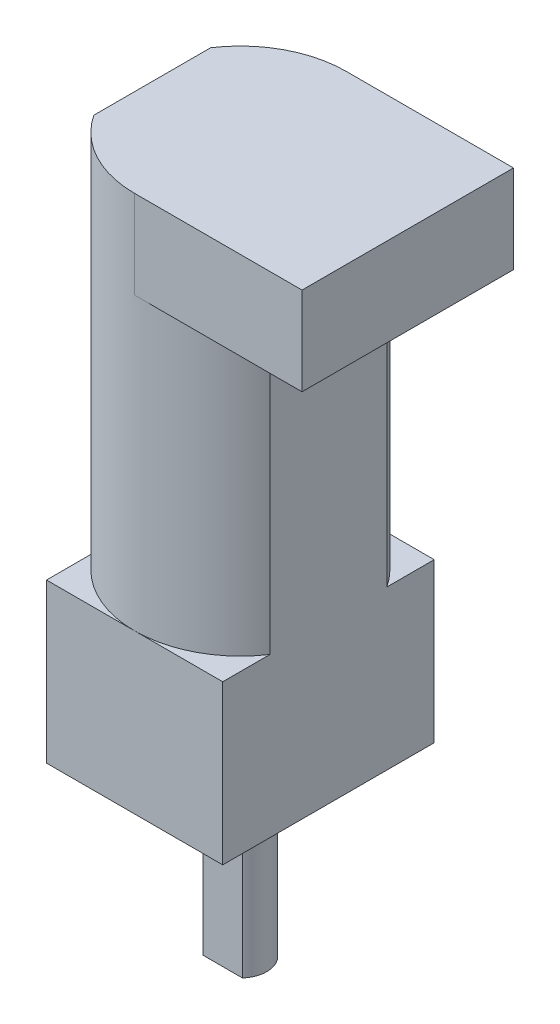
ISO-10303-21;
HEADER;
FILE_DESCRIPTION(('STEP AP214'),'2;1');
FILE_NAME('part.step','',(''),(''),'','','');
FILE_SCHEMA(('AUTOMOTIVE_DESIGN { 1 0 10303 214 1 1 1 1 }'));
ENDSEC;
DATA;
#1=APPLICATION_CONTEXT('core data for automotive mechanical design processes');
#2=APPLICATION_PROTOCOL_DEFINITION('international standard','automotive_design',2000,#1);
#3=PRODUCT_CONTEXT('',#1,'mechanical');
#4=PRODUCT('Part','Part','',(#3));
#5=PRODUCT_RELATED_PRODUCT_CATEGORY('part','',(#4));
#6=PRODUCT_DEFINITION_FORMATION('','',#4);
#7=PRODUCT_DEFINITION_CONTEXT('part definition',#1,'design');
#8=PRODUCT_DEFINITION('design','',#6,#7);
#9=PRODUCT_DEFINITION_SHAPE('','',#8);
#10=(LENGTH_UNIT() NAMED_UNIT(*) SI_UNIT(.MILLI.,.METRE.));
#11=(NAMED_UNIT(*) PLANE_ANGLE_UNIT() SI_UNIT($,.RADIAN.));
#12=(NAMED_UNIT(*) SI_UNIT($,.STERADIAN.) SOLID_ANGLE_UNIT());
#13=UNCERTAINTY_MEASURE_WITH_UNIT(LENGTH_MEASURE(1.E-05),#10,'distance_accuracy_value','');
#14=(GEOMETRIC_REPRESENTATION_CONTEXT(3) GLOBAL_UNCERTAINTY_ASSIGNED_CONTEXT((#13)) GLOBAL_UNIT_ASSIGNED_CONTEXT((#10,
#11,#12)) REPRESENTATION_CONTEXT('',''));
#15=CARTESIAN_POINT('',(0.,0.,0.));
#16=DIRECTION('',(0.,0.,1.));
#17=DIRECTION('',(1.,0.,0.));
#18=AXIS2_PLACEMENT_3D('',#15,#16,#17);
#19=CARTESIAN_POINT('',(0.,21.5,0.));
#20=DIRECTION('',(0.,-1.,0.));
#21=DIRECTION('',(0.,0.,-1.));
#22=AXIS2_PLACEMENT_3D('',#19,#20,#21);
#23=CYLINDRICAL_SURFACE('',#22,6.);
#24=DIRECTION('',(0.,1.,0.));
#25=VECTOR('',#24,1.);
#26=CARTESIAN_POINT('',(0.,16.5,6.));
#27=LINE('',#26,#25);
#28=CARTESIAN_POINT('',(0.,16.5,6.));
#29=VERTEX_POINT('',#28);
#30=CARTESIAN_POINT('',(0.,21.5,6.));
#31=VERTEX_POINT('',#30);
#32=EDGE_CURVE('E219',#29,#31,#27,.T.);
#33=ORIENTED_EDGE('',*,*,#32,.T.);
#34=CARTESIAN_POINT('',(0.,21.5,0.));
#35=DIRECTION('',(0.,1.,0.));
#36=DIRECTION('',(0.,0.,1.));
#37=AXIS2_PLACEMENT_3D('',#34,#35,#36);
#38=CIRCLE('',#37,6.);
#39=CARTESIAN_POINT('',(-5.,21.5,3.3166247903554));
#40=VERTEX_POINT('',#39);
#41=EDGE_CURVE('E238',#40,#31,#38,.T.);
#42=ORIENTED_EDGE('',*,*,#41,.F.);
#43=DIRECTION('',(0.,-1.,0.));
#44=VECTOR('',#43,1.);
#45=CARTESIAN_POINT('',(-5.,21.5,3.3166247903554));
#46=LINE('',#45,#44);
#47=CARTESIAN_POINT('',(-5.,0.,3.3166247903554));
#48=VERTEX_POINT('',#47);
#49=EDGE_CURVE('E246',#40,#48,#46,.T.);
#50=ORIENTED_EDGE('',*,*,#49,.T.);
#51=CARTESIAN_POINT('',(0.,0.,0.));
#52=DIRECTION('',(0.,1.,0.));
#53=DIRECTION('',(0.,0.,1.));
#54=AXIS2_PLACEMENT_3D('',#51,#52,#53);
#55=CIRCLE('',#54,6.);
#56=CARTESIAN_POINT('',(0.,0.,6.));
#57=VERTEX_POINT('',#56);
#58=EDGE_CURVE('E247',#48,#57,#55,.T.);
#59=ORIENTED_EDGE('',*,*,#58,.T.);
#60=CARTESIAN_POINT('',(5.,0.,3.3166247903554));
#61=VERTEX_POINT('',#60);
#62=EDGE_CURVE('E237',#57,#61,#55,.T.);
#63=ORIENTED_EDGE('',*,*,#62,.T.);
#64=DIRECTION('',(0.,-1.,0.));
#65=VECTOR('',#64,1.);
#66=CARTESIAN_POINT('',(5.,21.5,3.3166247903554));
#67=LINE('',#66,#65);
#68=CARTESIAN_POINT('',(5.,16.5,3.3166247903554));
#69=VERTEX_POINT('',#68);
#70=EDGE_CURVE('E260',#69,#61,#67,.T.);
#71=ORIENTED_EDGE('',*,*,#70,.F.);
#72=CARTESIAN_POINT('',(0.,16.5,0.));
#73=DIRECTION('',(0.,1.,0.));
#74=DIRECTION('',(0.,0.,1.));
#75=AXIS2_PLACEMENT_3D('',#72,#73,#74);
#76=CIRCLE('',#75,6.);
#77=EDGE_CURVE('E235',#29,#69,#76,.T.);
#78=ORIENTED_EDGE('',*,*,#77,.F.);
#79=EDGE_LOOP('',(#33,#42,#50,#59,#63,#71,#78));
#80=FACE_BOUND('',#79,.T.);
#81=ADVANCED_FACE('F40',(#80),#23,.T.);
#82=CARTESIAN_POINT('',(5.,21.5,3.3166247903554));
#83=DIRECTION('',(-1.,0.,0.));
#84=DIRECTION('',(0.,0.,1.));
#85=AXIS2_PLACEMENT_3D('',#82,#83,#84);
#86=PLANE('',#85);
#87=DIRECTION('',(0.,0.,-1.));
#88=VECTOR('',#87,1.);
#89=CARTESIAN_POINT('',(5.,16.5,3.3166247903554));
#90=LINE('',#89,#88);
#91=CARTESIAN_POINT('',(5.,16.5,-3.3166247903554));
#92=VERTEX_POINT('',#91);
#93=EDGE_CURVE('E227',#69,#92,#90,.T.);
#94=ORIENTED_EDGE('',*,*,#93,.F.);
#95=ORIENTED_EDGE('',*,*,#70,.T.);
#96=DIRECTION('',(0.,0.,1.));
#97=VECTOR('',#96,1.);
#98=CARTESIAN_POINT('',(5.,0.,-6.));
#99=LINE('',#98,#97);
#100=CARTESIAN_POINT('',(5.,0.,6.));
#101=VERTEX_POINT('',#100);
#102=EDGE_CURVE('E191',#61,#101,#99,.T.);
#103=ORIENTED_EDGE('',*,*,#102,.T.);
#104=DIRECTION('',(0.,1.,0.));
#105=VECTOR('',#104,1.);
#106=CARTESIAN_POINT('',(5.,-9.,6.));
#107=LINE('',#106,#105);
#108=CARTESIAN_POINT('',(5.,-9.,6.));
#109=VERTEX_POINT('',#108);
#110=EDGE_CURVE('E200',#109,#101,#107,.T.);
#111=ORIENTED_EDGE('',*,*,#110,.F.);
#112=DIRECTION('',(0.,0.,1.));
#113=VECTOR('',#112,1.);
#114=CARTESIAN_POINT('',(5.,-9.,-6.));
#115=LINE('',#114,#113);
#116=CARTESIAN_POINT('',(5.,-9.,-6.));
#117=VERTEX_POINT('',#116);
#118=EDGE_CURVE('E179',#117,#109,#115,.T.);
#119=ORIENTED_EDGE('',*,*,#118,.F.);
#120=DIRECTION('',(0.,1.,0.));
#121=VECTOR('',#120,1.);
#122=CARTESIAN_POINT('',(5.,-9.,-6.));
#123=LINE('',#122,#121);
#124=CARTESIAN_POINT('',(5.,0.,-6.));
#125=VERTEX_POINT('',#124);
#126=EDGE_CURVE('E203',#117,#125,#123,.T.);
#127=ORIENTED_EDGE('',*,*,#126,.T.);
#128=CARTESIAN_POINT('',(5.,0.,-3.31662479035541));
#129=VERTEX_POINT('',#128);
#130=EDGE_CURVE('E192',#125,#129,#99,.T.);
#131=ORIENTED_EDGE('',*,*,#130,.T.);
#132=DIRECTION('',(0.,-1.,0.));
#133=VECTOR('',#132,1.);
#134=CARTESIAN_POINT('',(5.,21.5,-3.3166247903554));
#135=LINE('',#134,#133);
#136=EDGE_CURVE('E258',#92,#129,#135,.T.);
#137=ORIENTED_EDGE('',*,*,#136,.F.);
#138=EDGE_LOOP('',(#94,#95,#103,#111,#119,#127,#131,#137));
#139=FACE_BOUND('',#138,.T.);
#140=ADVANCED_FACE('F303',(#139),#86,.F.);
#141=CARTESIAN_POINT('',(0.,21.5,0.));
#142=DIRECTION('',(0.,-1.,0.));
#143=DIRECTION('',(0.,0.,-1.));
#144=AXIS2_PLACEMENT_3D('',#141,#142,#143);
#145=CYLINDRICAL_SURFACE('',#144,6.);
#146=CARTESIAN_POINT('',(0.,21.5,0.));
#147=DIRECTION('',(0.,1.,0.));
#148=DIRECTION('',(0.,0.,1.));
#149=AXIS2_PLACEMENT_3D('',#146,#147,#148);
#150=CIRCLE('',#149,6.);
#151=CARTESIAN_POINT('',(0.,21.5,-6.));
#152=VERTEX_POINT('',#151);
#153=CARTESIAN_POINT('',(-5.,21.5,-3.3166247903554));
#154=VERTEX_POINT('',#153);
#155=EDGE_CURVE('E241',#152,#154,#150,.T.);
#156=ORIENTED_EDGE('',*,*,#155,.F.);
#157=DIRECTION('',(0.,1.,0.));
#158=VECTOR('',#157,1.);
#159=CARTESIAN_POINT('',(0.,16.5,-6.));
#160=LINE('',#159,#158);
#161=CARTESIAN_POINT('',(0.,16.5,-6.));
#162=VERTEX_POINT('',#161);
#163=EDGE_CURVE('E225',#162,#152,#160,.T.);
#164=ORIENTED_EDGE('',*,*,#163,.F.);
#165=CARTESIAN_POINT('',(0.,16.5,0.));
#166=DIRECTION('',(0.,1.,0.));
#167=DIRECTION('',(0.,0.,1.));
#168=AXIS2_PLACEMENT_3D('',#165,#166,#167);
#169=CIRCLE('',#168,6.);
#170=EDGE_CURVE('E43',#92,#162,#169,.T.);
#171=ORIENTED_EDGE('',*,*,#170,.F.);
#172=ORIENTED_EDGE('',*,*,#136,.T.);
#173=CARTESIAN_POINT('',(0.,0.,0.));
#174=DIRECTION('',(0.,1.,0.));
#175=DIRECTION('',(0.,0.,1.));
#176=AXIS2_PLACEMENT_3D('',#173,#174,#175);
#177=CIRCLE('',#176,6.);
#178=CARTESIAN_POINT('',(0.,0.,-6.));
#179=VERTEX_POINT('',#178);
#180=EDGE_CURVE('E242',#129,#179,#177,.T.);
#181=ORIENTED_EDGE('',*,*,#180,.T.);
#182=CARTESIAN_POINT('',(-5.,0.,-3.3166247903554));
#183=VERTEX_POINT('',#182);
#184=EDGE_CURVE('E250',#179,#183,#177,.T.);
#185=ORIENTED_EDGE('',*,*,#184,.T.);
#186=DIRECTION('',(0.,-1.,0.));
#187=VECTOR('',#186,1.);
#188=CARTESIAN_POINT('',(-5.,21.5,-3.3166247903554));
#189=LINE('',#188,#187);
#190=EDGE_CURVE('E255',#154,#183,#189,.T.);
#191=ORIENTED_EDGE('',*,*,#190,.F.);
#192=EDGE_LOOP('',(#156,#164,#171,#172,#181,#185,#191));
#193=FACE_BOUND('',#192,.T.);
#194=ADVANCED_FACE('F277',(#193),#145,.T.);
#195=CARTESIAN_POINT('',(-5.,21.5,3.3166247903554));
#196=DIRECTION('',(1.,0.,0.));
#197=DIRECTION('',(0.,0.,-1.));
#198=AXIS2_PLACEMENT_3D('',#195,#196,#197);
#199=PLANE('',#198);
#200=ORIENTED_EDGE('',*,*,#190,.T.);
#201=DIRECTION('',(0.,0.,-1.));
#202=VECTOR('',#201,1.);
#203=CARTESIAN_POINT('',(-5.,0.,-6.));
#204=LINE('',#203,#202);
#205=CARTESIAN_POINT('',(-5.,0.,-6.));
#206=VERTEX_POINT('',#205);
#207=EDGE_CURVE('E171',#183,#206,#204,.T.);
#208=ORIENTED_EDGE('',*,*,#207,.T.);
#209=DIRECTION('',(0.,1.,0.));
#210=VECTOR('',#209,1.);
#211=CARTESIAN_POINT('',(-5.,-9.,-6.));
#212=LINE('',#211,#210);
#213=CARTESIAN_POINT('',(-5.,-9.,-6.));
#214=VERTEX_POINT('',#213);
#215=EDGE_CURVE('E206',#214,#206,#212,.T.);
#216=ORIENTED_EDGE('',*,*,#215,.F.);
#217=DIRECTION('',(0.,0.,-1.));
#218=VECTOR('',#217,1.);
#219=CARTESIAN_POINT('',(-5.,-9.,-6.));
#220=LINE('',#219,#218);
#221=CARTESIAN_POINT('',(-5.,-9.,6.));
#222=VERTEX_POINT('',#221);
#223=EDGE_CURVE('E173',#222,#214,#220,.T.);
#224=ORIENTED_EDGE('',*,*,#223,.F.);
#225=DIRECTION('',(0.,1.,0.));
#226=VECTOR('',#225,1.);
#227=CARTESIAN_POINT('',(-5.,-9.,6.));
#228=LINE('',#227,#226);
#229=CARTESIAN_POINT('',(-5.,0.,6.));
#230=VERTEX_POINT('',#229);
#231=EDGE_CURVE('E183',#222,#230,#228,.T.);
#232=ORIENTED_EDGE('',*,*,#231,.T.);
#233=EDGE_CURVE('E184',#230,#48,#204,.T.);
#234=ORIENTED_EDGE('',*,*,#233,.T.);
#235=ORIENTED_EDGE('',*,*,#49,.F.);
#236=DIRECTION('',(0.,0.,1.));
#237=VECTOR('',#236,1.);
#238=CARTESIAN_POINT('',(-5.,21.5,3.3166247903554));
#239=LINE('',#238,#237);
#240=EDGE_CURVE('E244',#154,#40,#239,.T.);
#241=ORIENTED_EDGE('',*,*,#240,.F.);
#242=EDGE_LOOP('',(#200,#208,#216,#224,#232,#234,#235,#241));
#243=FACE_BOUND('',#242,.T.);
#244=ADVANCED_FACE('F285',(#243),#199,.F.);
#245=CARTESIAN_POINT('',(0.,21.5,0.));
#246=DIRECTION('',(0.,1.,0.));
#247=DIRECTION('',(0.,0.,1.));
#248=AXIS2_PLACEMENT_3D('',#245,#246,#247);
#249=PLANE('',#248);
#250=ORIENTED_EDGE('',*,*,#41,.T.);
#251=DIRECTION('',(1.,0.,0.));
#252=VECTOR('',#251,1.);
#253=CARTESIAN_POINT('',(0.,21.5,6.));
#254=LINE('',#253,#252);
#255=CARTESIAN_POINT('',(9.5,21.5,6.));
#256=VERTEX_POINT('',#255);
#257=EDGE_CURVE('E209',#31,#256,#254,.T.);
#258=ORIENTED_EDGE('',*,*,#257,.T.);
#259=DIRECTION('',(0.,0.,-1.));
#260=VECTOR('',#259,1.);
#261=CARTESIAN_POINT('',(9.5,21.5,-6.));
#262=LINE('',#261,#260);
#263=CARTESIAN_POINT('',(9.5,21.5,-6.));
#264=VERTEX_POINT('',#263);
#265=EDGE_CURVE('E222',#256,#264,#262,.T.);
#266=ORIENTED_EDGE('',*,*,#265,.T.);
#267=DIRECTION('',(-1.,0.,0.));
#268=VECTOR('',#267,1.);
#269=CARTESIAN_POINT('',(0.,21.5,-6.));
#270=LINE('',#269,#268);
#271=EDGE_CURVE('E62',#264,#152,#270,.T.);
#272=ORIENTED_EDGE('',*,*,#271,.T.);
#273=ORIENTED_EDGE('',*,*,#155,.T.);
#274=ORIENTED_EDGE('',*,*,#240,.T.);
#275=EDGE_LOOP('',(#250,#258,#266,#272,#273,#274));
#276=FACE_BOUND('',#275,.T.);
#277=ADVANCED_FACE('F281',(#276),#249,.T.);
#278=CARTESIAN_POINT('',(0.,16.5,-6.));
#279=DIRECTION('',(0.,0.,-1.));
#280=DIRECTION('',(-1.,0.,0.));
#281=AXIS2_PLACEMENT_3D('',#278,#279,#280);
#282=PLANE('',#281);
#283=ORIENTED_EDGE('',*,*,#271,.F.);
#284=DIRECTION('',(0.,1.,0.));
#285=VECTOR('',#284,1.);
#286=CARTESIAN_POINT('',(9.5,16.5,-6.));
#287=LINE('',#286,#285);
#288=CARTESIAN_POINT('',(9.5,16.5,-6.));
#289=VERTEX_POINT('',#288);
#290=EDGE_CURVE('E228',#289,#264,#287,.T.);
#291=ORIENTED_EDGE('',*,*,#290,.F.);
#292=DIRECTION('',(-1.,0.,0.));
#293=VECTOR('',#292,1.);
#294=CARTESIAN_POINT('',(0.,16.5,-6.));
#295=LINE('',#294,#293);
#296=EDGE_CURVE('E216',#289,#162,#295,.T.);
#297=ORIENTED_EDGE('',*,*,#296,.T.);
#298=ORIENTED_EDGE('',*,*,#163,.T.);
#299=EDGE_LOOP('',(#283,#291,#297,#298));
#300=FACE_BOUND('',#299,.T.);
#301=ADVANCED_FACE('F275',(#300),#282,.T.);
#302=CARTESIAN_POINT('',(9.5,16.5,-6.));
#303=DIRECTION('',(1.,0.,0.));
#304=DIRECTION('',(0.,0.,-1.));
#305=AXIS2_PLACEMENT_3D('',#302,#303,#304);
#306=PLANE('',#305);
#307=ORIENTED_EDGE('',*,*,#265,.F.);
#308=DIRECTION('',(0.,1.,0.));
#309=VECTOR('',#308,1.);
#310=CARTESIAN_POINT('',(9.5,16.5,6.));
#311=LINE('',#310,#309);
#312=CARTESIAN_POINT('',(9.5,16.5,6.));
#313=VERTEX_POINT('',#312);
#314=EDGE_CURVE('E230',#313,#256,#311,.T.);
#315=ORIENTED_EDGE('',*,*,#314,.F.);
#316=DIRECTION('',(0.,0.,-1.));
#317=VECTOR('',#316,1.);
#318=CARTESIAN_POINT('',(9.5,16.5,-6.));
#319=LINE('',#318,#317);
#320=EDGE_CURVE('E213',#313,#289,#319,.T.);
#321=ORIENTED_EDGE('',*,*,#320,.T.);
#322=ORIENTED_EDGE('',*,*,#290,.T.);
#323=EDGE_LOOP('',(#307,#315,#321,#322));
#324=FACE_BOUND('',#323,.T.);
#325=ADVANCED_FACE('F293',(#324),#306,.T.);
#326=CARTESIAN_POINT('',(0.,16.5,6.));
#327=DIRECTION('',(0.,0.,1.));
#328=DIRECTION('',(1.,0.,0.));
#329=AXIS2_PLACEMENT_3D('',#326,#327,#328);
#330=PLANE('',#329);
#331=ORIENTED_EDGE('',*,*,#257,.F.);
#332=ORIENTED_EDGE('',*,*,#32,.F.);
#333=DIRECTION('',(1.,0.,0.));
#334=VECTOR('',#333,1.);
#335=CARTESIAN_POINT('',(0.,16.5,6.));
#336=LINE('',#335,#334);
#337=EDGE_CURVE('E210',#29,#313,#336,.T.);
#338=ORIENTED_EDGE('',*,*,#337,.T.);
#339=ORIENTED_EDGE('',*,*,#314,.T.);
#340=EDGE_LOOP('',(#331,#332,#338,#339));
#341=FACE_BOUND('',#340,.T.);
#342=ADVANCED_FACE('F290',(#341),#330,.T.);
#343=CARTESIAN_POINT('',(0.,16.5,0.));
#344=DIRECTION('',(0.,1.,0.));
#345=DIRECTION('',(0.,0.,1.));
#346=AXIS2_PLACEMENT_3D('',#343,#344,#345);
#347=PLANE('',#346);
#348=ORIENTED_EDGE('',*,*,#337,.F.);
#349=ORIENTED_EDGE('',*,*,#77,.T.);
#350=ORIENTED_EDGE('',*,*,#93,.T.);
#351=ORIENTED_EDGE('',*,*,#170,.T.);
#352=ORIENTED_EDGE('',*,*,#296,.F.);
#353=ORIENTED_EDGE('',*,*,#320,.F.);
#354=EDGE_LOOP('',(#348,#349,#350,#351,#352,#353));
#355=FACE_BOUND('',#354,.T.);
#356=ADVANCED_FACE('F269',(#355),#347,.F.);
#357=CARTESIAN_POINT('',(0.,0.,0.));
#358=DIRECTION('',(0.,1.,0.));
#359=DIRECTION('',(0.,0.,1.));
#360=AXIS2_PLACEMENT_3D('',#357,#358,#359);
#361=PLANE('',#360);
#362=ORIENTED_EDGE('',*,*,#58,.F.);
#363=ORIENTED_EDGE('',*,*,#233,.F.);
#364=DIRECTION('',(-1.,0.,0.));
#365=VECTOR('',#364,1.);
#366=CARTESIAN_POINT('',(-5.,0.,6.));
#367=LINE('',#366,#365);
#368=EDGE_CURVE('E195',#57,#230,#367,.T.);
#369=ORIENTED_EDGE('',*,*,#368,.F.);
#370=EDGE_LOOP('',(#362,#363,#369));
#371=FACE_BOUND('',#370,.T.);
#372=ADVANCED_FACE('F344',(#371),#361,.T.);
#373=ORIENTED_EDGE('',*,*,#62,.F.);
#374=EDGE_CURVE('E177',#101,#57,#367,.T.);
#375=ORIENTED_EDGE('',*,*,#374,.F.);
#376=ORIENTED_EDGE('',*,*,#102,.F.);
#377=EDGE_LOOP('',(#373,#375,#376));
#378=FACE_BOUND('',#377,.T.);
#379=ADVANCED_FACE('F376',(#378),#361,.T.);
#380=ORIENTED_EDGE('',*,*,#180,.F.);
#381=ORIENTED_EDGE('',*,*,#130,.F.);
#382=DIRECTION('',(1.,0.,0.));
#383=VECTOR('',#382,1.);
#384=CARTESIAN_POINT('',(-5.,0.,-6.));
#385=LINE('',#384,#383);
#386=EDGE_CURVE('E187',#179,#125,#385,.T.);
#387=ORIENTED_EDGE('',*,*,#386,.F.);
#388=EDGE_LOOP('',(#380,#381,#387));
#389=FACE_BOUND('',#388,.T.);
#390=ADVANCED_FACE('F388',(#389),#361,.T.);
#391=ORIENTED_EDGE('',*,*,#184,.F.);
#392=EDGE_CURVE('E188',#206,#179,#385,.T.);
#393=ORIENTED_EDGE('',*,*,#392,.F.);
#394=ORIENTED_EDGE('',*,*,#207,.F.);
#395=EDGE_LOOP('',(#391,#393,#394));
#396=FACE_BOUND('',#395,.T.);
#397=ADVANCED_FACE('F379',(#396),#361,.T.);
#398=CARTESIAN_POINT('',(-5.,-9.,-6.));
#399=DIRECTION('',(0.,0.,1.));
#400=DIRECTION('',(1.,0.,0.));
#401=AXIS2_PLACEMENT_3D('',#398,#399,#400);
#402=PLANE('',#401);
#403=ORIENTED_EDGE('',*,*,#392,.T.);
#404=ORIENTED_EDGE('',*,*,#386,.T.);
#405=ORIENTED_EDGE('',*,*,#126,.F.);
#406=DIRECTION('',(1.,0.,0.));
#407=VECTOR('',#406,1.);
#408=CARTESIAN_POINT('',(-5.,-9.,-6.));
#409=LINE('',#408,#407);
#410=EDGE_CURVE('E176',#214,#117,#409,.T.);
#411=ORIENTED_EDGE('',*,*,#410,.F.);
#412=ORIENTED_EDGE('',*,*,#215,.T.);
#413=EDGE_LOOP('',(#403,#404,#405,#411,#412));
#414=FACE_BOUND('',#413,.T.);
#415=ADVANCED_FACE('F407',(#414),#402,.F.);
#416=CARTESIAN_POINT('',(-5.,-9.,6.));
#417=DIRECTION('',(0.,0.,-1.));
#418=DIRECTION('',(-1.,0.,0.));
#419=AXIS2_PLACEMENT_3D('',#416,#417,#418);
#420=PLANE('',#419);
#421=ORIENTED_EDGE('',*,*,#374,.T.);
#422=ORIENTED_EDGE('',*,*,#368,.T.);
#423=ORIENTED_EDGE('',*,*,#231,.F.);
#424=DIRECTION('',(-1.,0.,0.));
#425=VECTOR('',#424,1.);
#426=CARTESIAN_POINT('',(-5.,-9.,6.));
#427=LINE('',#426,#425);
#428=EDGE_CURVE('E181',#109,#222,#427,.T.);
#429=ORIENTED_EDGE('',*,*,#428,.F.);
#430=ORIENTED_EDGE('',*,*,#110,.T.);
#431=EDGE_LOOP('',(#421,#422,#423,#429,#430));
#432=FACE_BOUND('',#431,.T.);
#433=ADVANCED_FACE('F417',(#432),#420,.F.);
#434=CARTESIAN_POINT('',(0.,-9.,0.));
#435=DIRECTION('',(0.,1.,0.));
#436=DIRECTION('',(0.,0.,1.));
#437=AXIS2_PLACEMENT_3D('',#434,#435,#436);
#438=PLANE('',#437);
#439=CARTESIAN_POINT('',(0.,-9.,0.));
#440=DIRECTION('',(0.,-1.,0.));
#441=DIRECTION('',(0.,0.,-1.));
#442=AXIS2_PLACEMENT_3D('',#439,#440,#441);
#443=CIRCLE('',#442,2.);
#444=CARTESIAN_POINT('',(0.,-9.,-2.));
#445=VERTEX_POINT('',#444);
#446=EDGE_CURVE('E12',#445,#445,#443,.T.);
#447=ORIENTED_EDGE('',*,*,#446,.F.);
#448=EDGE_LOOP('',(#447));
#449=FACE_BOUND('',#448,.T.);
#450=ORIENTED_EDGE('',*,*,#223,.T.);
#451=ORIENTED_EDGE('',*,*,#410,.T.);
#452=ORIENTED_EDGE('',*,*,#118,.T.);
#453=ORIENTED_EDGE('',*,*,#428,.T.);
#454=EDGE_LOOP('',(#450,#451,#452,#453));
#455=FACE_BOUND('',#454,.T.);
#456=ADVANCED_FACE('F428',(#449,#455),#438,.F.);
#457=CARTESIAN_POINT('',(0.,-9.7,0.));
#458=DIRECTION('',(0.,1.,0.));
#459=DIRECTION('',(0.,0.,1.));
#460=AXIS2_PLACEMENT_3D('',#457,#458,#459);
#461=CYLINDRICAL_SURFACE('',#460,2.);
#462=CARTESIAN_POINT('',(0.,-9.7,0.));
#463=DIRECTION('',(0.,-1.,0.));
#464=DIRECTION('',(0.,0.,-1.));
#465=AXIS2_PLACEMENT_3D('',#462,#463,#464);
#466=CIRCLE('',#465,2.);
#467=CARTESIAN_POINT('',(0.,-9.7,-2.));
#468=VERTEX_POINT('',#467);
#469=EDGE_CURVE('E169',#468,#468,#466,.T.);
#470=ORIENTED_EDGE('',*,*,#469,.F.);
#471=EDGE_LOOP('',(#470));
#472=FACE_BOUND('',#471,.T.);
#473=ORIENTED_EDGE('',*,*,#446,.T.);
#474=EDGE_LOOP('',(#473));
#475=FACE_BOUND('',#474,.T.);
#476=ADVANCED_FACE('F439',(#472,#475),#461,.T.);
#477=CARTESIAN_POINT('',(0.,-9.7,0.));
#478=DIRECTION('',(0.,-1.,0.));
#479=DIRECTION('',(0.,0.,-1.));
#480=AXIS2_PLACEMENT_3D('',#477,#478,#479);
#481=PLANE('',#480);
#482=CARTESIAN_POINT('',(0.,-9.7,0.));
#483=DIRECTION('',(0.,-1.,0.));
#484=DIRECTION('',(0.,0.,-1.));
#485=AXIS2_PLACEMENT_3D('',#482,#483,#484);
#486=CIRCLE('',#485,1.5);
#487=CARTESIAN_POINT('',(-1.11803398874989,-9.7,1.));
#488=VERTEX_POINT('',#487);
#489=CARTESIAN_POINT('',(1.11803398874989,-9.7,1.));
#490=VERTEX_POINT('',#489);
#491=EDGE_CURVE('E146',#488,#490,#486,.T.);
#492=ORIENTED_EDGE('',*,*,#491,.F.);
#493=DIRECTION('',(-1.,0.,0.));
#494=VECTOR('',#493,1.);
#495=CARTESIAN_POINT('',(-1.11803398874989,-9.7,1.));
#496=LINE('',#495,#494);
#497=EDGE_CURVE('E54',#490,#488,#496,.T.);
#498=ORIENTED_EDGE('',*,*,#497,.F.);
#499=EDGE_LOOP('',(#492,#498));
#500=FACE_BOUND('',#499,.T.);
#501=ORIENTED_EDGE('',*,*,#469,.T.);
#502=EDGE_LOOP('',(#501));
#503=FACE_BOUND('',#502,.T.);
#504=ADVANCED_FACE('F148',(#500,#503),#481,.T.);
#505=CARTESIAN_POINT('',(-1.11803398874989,-32.9051248379533,1.));
#506=DIRECTION('',(0.,0.,-1.));
#507=DIRECTION('',(-1.,0.,0.));
#508=AXIS2_PLACEMENT_3D('',#505,#506,#507);
#509=PLANE('',#508);
#510=DIRECTION('',(0.,1.,0.));
#511=VECTOR('',#510,1.);
#512=CARTESIAN_POINT('',(-1.11803398874989,-32.9051248379533,1.));
#513=LINE('',#512,#511);
#514=CARTESIAN_POINT('',(-1.11803398874989,-19.,1.));
#515=VERTEX_POINT('',#514);
#516=EDGE_CURVE('E155',#515,#488,#513,.T.);
#517=ORIENTED_EDGE('',*,*,#516,.F.);
#518=DIRECTION('',(1.,0.,0.));
#519=VECTOR('',#518,1.);
#520=CARTESIAN_POINT('',(-1.11803398874989,-19.,1.));
#521=LINE('',#520,#519);
#522=CARTESIAN_POINT('',(1.11803398874989,-19.,1.));
#523=VERTEX_POINT('',#522);
#524=EDGE_CURVE('E167',#515,#523,#521,.T.);
#525=ORIENTED_EDGE('',*,*,#524,.T.);
#526=DIRECTION('',(0.,1.,0.));
#527=VECTOR('',#526,1.);
#528=CARTESIAN_POINT('',(1.11803398874989,-32.9051248379533,1.));
#529=LINE('',#528,#527);
#530=EDGE_CURVE('E160',#523,#490,#529,.T.);
#531=ORIENTED_EDGE('',*,*,#530,.T.);
#532=ORIENTED_EDGE('',*,*,#497,.T.);
#533=EDGE_LOOP('',(#517,#525,#531,#532));
#534=FACE_BOUND('',#533,.T.);
#535=ADVANCED_FACE('F162',(#534),#509,.F.);
#536=CARTESIAN_POINT('',(0.,-32.9051248379533,0.));
#537=DIRECTION('',(0.,1.,0.));
#538=DIRECTION('',(0.,0.,1.));
#539=AXIS2_PLACEMENT_3D('',#536,#537,#538);
#540=CYLINDRICAL_SURFACE('',#539,1.5);
#541=ORIENTED_EDGE('',*,*,#530,.F.);
#542=CARTESIAN_POINT('',(0.,-19.,0.));
#543=DIRECTION('',(0.,1.,0.));
#544=DIRECTION('',(0.,0.,1.));
#545=AXIS2_PLACEMENT_3D('',#542,#543,#544);
#546=CIRCLE('',#545,1.5);
#547=EDGE_CURVE('E157',#523,#515,#546,.T.);
#548=ORIENTED_EDGE('',*,*,#547,.T.);
#549=ORIENTED_EDGE('',*,*,#516,.T.);
#550=ORIENTED_EDGE('',*,*,#491,.T.);
#551=EDGE_LOOP('',(#541,#548,#549,#550));
#552=FACE_BOUND('',#551,.T.);
#553=ADVANCED_FACE('F156',(#552),#540,.T.);
#554=CARTESIAN_POINT('',(0.,-19.,0.));
#555=DIRECTION('',(0.,1.,0.));
#556=DIRECTION('',(0.,0.,1.));
#557=AXIS2_PLACEMENT_3D('',#554,#555,#556);
#558=PLANE('',#557);
#559=ORIENTED_EDGE('',*,*,#524,.F.);
#560=ORIENTED_EDGE('',*,*,#547,.F.);
#561=EDGE_LOOP('',(#559,#560));
#562=FACE_BOUND('',#561,.T.);
#563=ADVANCED_FACE('F478',(#562),#558,.F.);
#564=CLOSED_SHELL('',(#81,#140,#194,#244,#277,#301,#325,#342,#356,#372,#379,#390,#397,#415,#433,
#456,#476,#504,#535,#553,#563));
#565=MANIFOLD_SOLID_BREP('B2',#564);
#566=ADVANCED_BREP_SHAPE_REPRESENTATION('',(#18,#565),#14);
#567=SHAPE_DEFINITION_REPRESENTATION(#9,#566);
ENDSEC;
END-ISO-10303-21;
